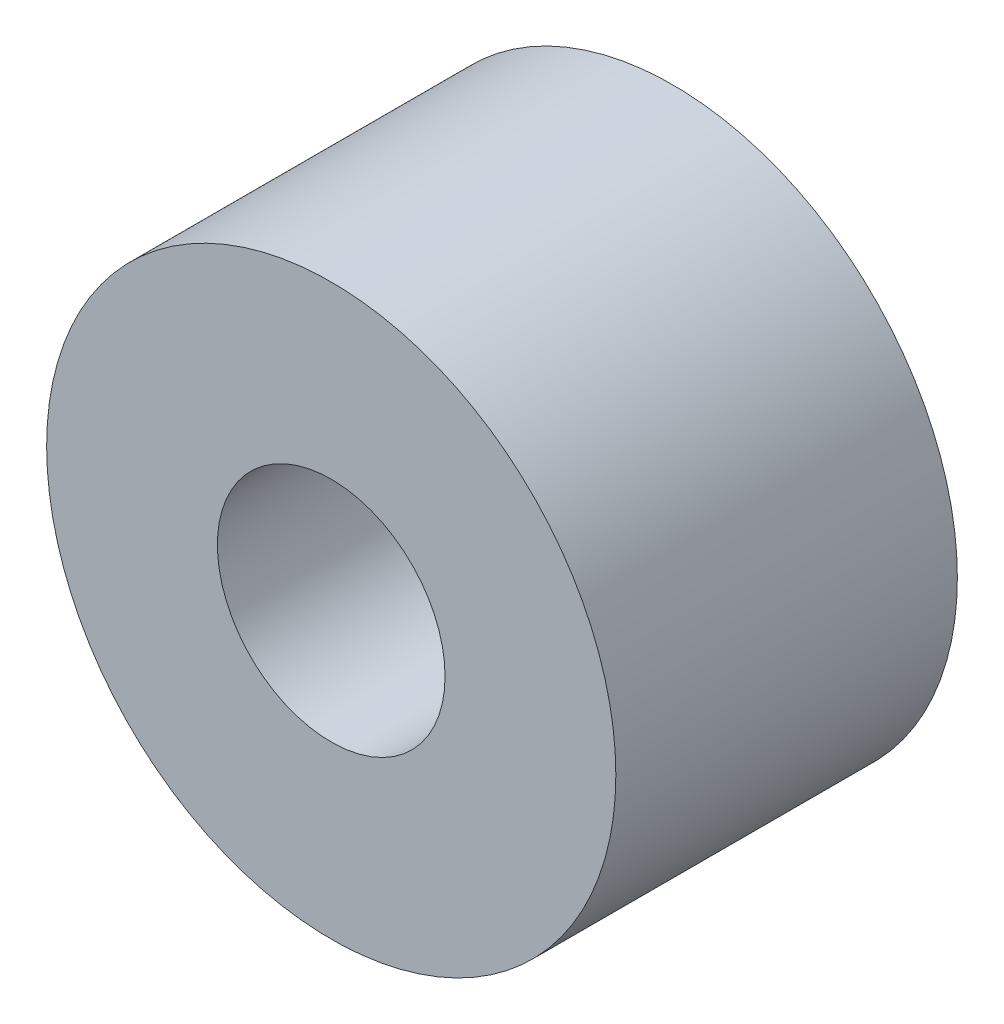
ISO-10303-21;
HEADER;
FILE_DESCRIPTION(('STEP AP214'),'2;1');
FILE_NAME('part.step','',(''),(''),'','','');
FILE_SCHEMA(('AUTOMOTIVE_DESIGN { 1 0 10303 214 1 1 1 1 }'));
ENDSEC;
DATA;
#1=APPLICATION_CONTEXT('core data for automotive mechanical design processes');
#2=APPLICATION_PROTOCOL_DEFINITION('international standard','automotive_design',2000,#1);
#3=PRODUCT_CONTEXT('',#1,'mechanical');
#4=PRODUCT('Part','Part','',(#3));
#5=PRODUCT_RELATED_PRODUCT_CATEGORY('part','',(#4));
#6=PRODUCT_DEFINITION_FORMATION('','',#4);
#7=PRODUCT_DEFINITION_CONTEXT('part definition',#1,'design');
#8=PRODUCT_DEFINITION('design','',#6,#7);
#9=PRODUCT_DEFINITION_SHAPE('','',#8);
#10=(LENGTH_UNIT() NAMED_UNIT(*) SI_UNIT(.MILLI.,.METRE.));
#11=(NAMED_UNIT(*) PLANE_ANGLE_UNIT() SI_UNIT($,.RADIAN.));
#12=(NAMED_UNIT(*) SI_UNIT($,.STERADIAN.) SOLID_ANGLE_UNIT());
#13=UNCERTAINTY_MEASURE_WITH_UNIT(LENGTH_MEASURE(1.E-05),#10,'distance_accuracy_value','');
#14=(GEOMETRIC_REPRESENTATION_CONTEXT(3) GLOBAL_UNCERTAINTY_ASSIGNED_CONTEXT((#13)) GLOBAL_UNIT_ASSIGNED_CONTEXT((#10,
#11,#12)) REPRESENTATION_CONTEXT('',''));
#15=CARTESIAN_POINT('',(0.,0.,0.));
#16=DIRECTION('',(0.,0.,1.));
#17=DIRECTION('',(1.,0.,0.));
#18=AXIS2_PLACEMENT_3D('',#15,#16,#17);
#19=CARTESIAN_POINT('',(0.,0.,3.));
#20=DIRECTION('',(0.,0.,1.));
#21=DIRECTION('',(1.,0.,0.));
#22=AXIS2_PLACEMENT_3D('',#19,#20,#21);
#23=PLANE('',#22);
#24=CARTESIAN_POINT('',(0.,0.,3.));
#25=DIRECTION('',(0.,0.,1.));
#26=DIRECTION('',(1.,0.,0.));
#27=AXIS2_PLACEMENT_3D('',#24,#25,#26);
#28=CIRCLE('',#27,2.5);
#29=CARTESIAN_POINT('',(2.5,0.,3.));
#30=VERTEX_POINT('',#29);
#31=EDGE_CURVE('E10',#30,#30,#28,.T.);
#32=ORIENTED_EDGE('',*,*,#31,.T.);
#33=EDGE_LOOP('',(#32));
#34=FACE_BOUND('',#33,.T.);
#35=CARTESIAN_POINT('',(0.,0.,3.));
#36=DIRECTION('',(0.,0.,1.));
#37=DIRECTION('',(1.,0.,0.));
#38=AXIS2_PLACEMENT_3D('',#35,#36,#37);
#39=CIRCLE('',#38,1.);
#40=CARTESIAN_POINT('',(1.,0.,3.));
#41=VERTEX_POINT('',#40);
#42=EDGE_CURVE('E42',#41,#41,#39,.T.);
#43=ORIENTED_EDGE('',*,*,#42,.F.);
#44=EDGE_LOOP('',(#43));
#45=FACE_BOUND('',#44,.T.);
#46=ADVANCED_FACE('F31',(#34,#45),#23,.T.);
#47=CARTESIAN_POINT('',(0.,0.,0.));
#48=DIRECTION('',(0.,0.,1.));
#49=DIRECTION('',(1.,0.,0.));
#50=AXIS2_PLACEMENT_3D('',#47,#48,#49);
#51=PLANE('',#50);
#52=CARTESIAN_POINT('',(0.,0.,0.));
#53=DIRECTION('',(0.,0.,1.));
#54=DIRECTION('',(1.,0.,0.));
#55=AXIS2_PLACEMENT_3D('',#52,#53,#54);
#56=CIRCLE('',#55,2.5);
#57=CARTESIAN_POINT('',(2.5,0.,0.));
#58=VERTEX_POINT('',#57);
#59=EDGE_CURVE('E35',#58,#58,#56,.T.);
#60=ORIENTED_EDGE('',*,*,#59,.F.);
#61=EDGE_LOOP('',(#60));
#62=FACE_BOUND('',#61,.T.);
#63=CARTESIAN_POINT('',(0.,0.,0.));
#64=DIRECTION('',(0.,0.,1.));
#65=DIRECTION('',(1.,0.,0.));
#66=AXIS2_PLACEMENT_3D('',#63,#64,#65);
#67=CIRCLE('',#66,1.);
#68=CARTESIAN_POINT('',(1.,0.,0.));
#69=VERTEX_POINT('',#68);
#70=EDGE_CURVE('E44',#69,#69,#67,.T.);
#71=ORIENTED_EDGE('',*,*,#70,.T.);
#72=EDGE_LOOP('',(#71));
#73=FACE_BOUND('',#72,.T.);
#74=ADVANCED_FACE('F54',(#62,#73),#51,.F.);
#75=CARTESIAN_POINT('',(0.,0.,3.));
#76=DIRECTION('',(0.,0.,-1.));
#77=DIRECTION('',(-1.,0.,0.));
#78=AXIS2_PLACEMENT_3D('',#75,#76,#77);
#79=CYLINDRICAL_SURFACE('',#78,2.5);
#80=ORIENTED_EDGE('',*,*,#31,.F.);
#81=EDGE_LOOP('',(#80));
#82=FACE_BOUND('',#81,.T.);
#83=ORIENTED_EDGE('',*,*,#59,.T.);
#84=EDGE_LOOP('',(#83));
#85=FACE_BOUND('',#84,.T.);
#86=ADVANCED_FACE('F33',(#82,#85),#79,.T.);
#87=CARTESIAN_POINT('',(0.,0.,3.));
#88=DIRECTION('',(0.,0.,-1.));
#89=DIRECTION('',(-1.,0.,0.));
#90=AXIS2_PLACEMENT_3D('',#87,#88,#89);
#91=CYLINDRICAL_SURFACE('',#90,1.);
#92=ORIENTED_EDGE('',*,*,#42,.T.);
#93=EDGE_LOOP('',(#92));
#94=FACE_BOUND('',#93,.T.);
#95=ORIENTED_EDGE('',*,*,#70,.F.);
#96=EDGE_LOOP('',(#95));
#97=FACE_BOUND('',#96,.T.);
#98=ADVANCED_FACE('F50',(#94,#97),#91,.F.);
#99=CLOSED_SHELL('',(#46,#74,#86,#98));
#100=MANIFOLD_SOLID_BREP('B2',#99);
#101=ADVANCED_BREP_SHAPE_REPRESENTATION('',(#18,#100),#14);
#102=SHAPE_DEFINITION_REPRESENTATION(#9,#101);
ENDSEC;
END-ISO-10303-21;
